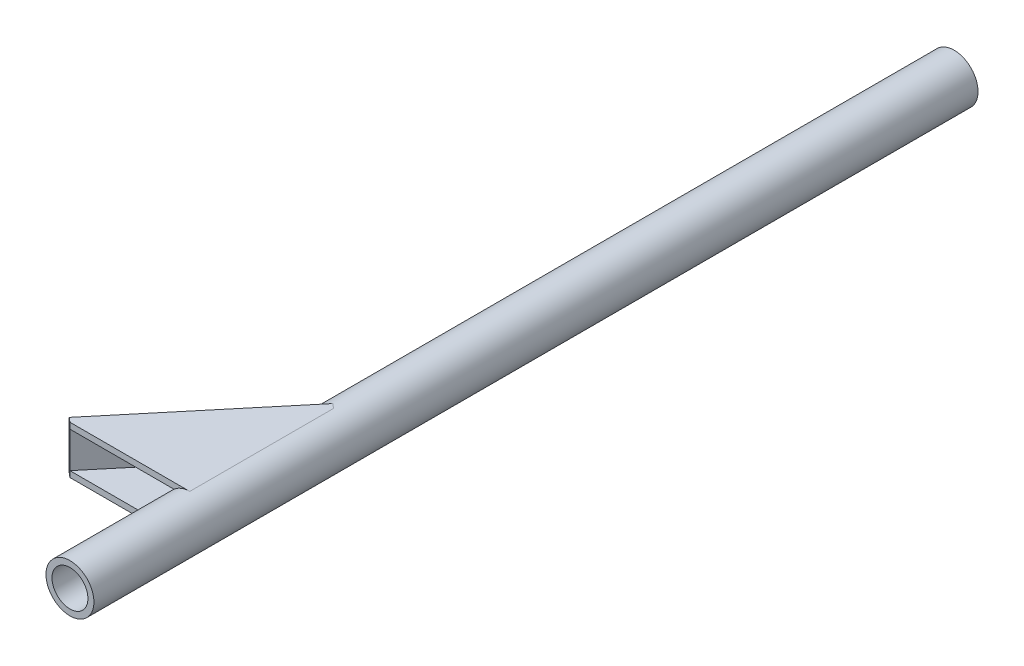
ISO-10303-21;
HEADER;
FILE_DESCRIPTION(('STEP AP214'),'2;1');
FILE_NAME('part.step','',(''),(''),'','','');
FILE_SCHEMA(('AUTOMOTIVE_DESIGN { 1 0 10303 214 1 1 1 1 }'));
ENDSEC;
DATA;
#1=APPLICATION_CONTEXT('core data for automotive mechanical design processes');
#2=APPLICATION_PROTOCOL_DEFINITION('international standard','automotive_design',2000,#1);
#3=PRODUCT_CONTEXT('',#1,'mechanical');
#4=PRODUCT('Part','Part','',(#3));
#5=PRODUCT_RELATED_PRODUCT_CATEGORY('part','',(#4));
#6=PRODUCT_DEFINITION_FORMATION('','',#4);
#7=PRODUCT_DEFINITION_CONTEXT('part definition',#1,'design');
#8=PRODUCT_DEFINITION('design','',#6,#7);
#9=PRODUCT_DEFINITION_SHAPE('','',#8);
#10=(LENGTH_UNIT() NAMED_UNIT(*) SI_UNIT(.MILLI.,.METRE.));
#11=(NAMED_UNIT(*) PLANE_ANGLE_UNIT() SI_UNIT($,.RADIAN.));
#12=(NAMED_UNIT(*) SI_UNIT($,.STERADIAN.) SOLID_ANGLE_UNIT());
#13=UNCERTAINTY_MEASURE_WITH_UNIT(LENGTH_MEASURE(1.E-05),#10,'distance_accuracy_value','');
#14=(GEOMETRIC_REPRESENTATION_CONTEXT(3) GLOBAL_UNCERTAINTY_ASSIGNED_CONTEXT((#13)) GLOBAL_UNIT_ASSIGNED_CONTEXT((#10,
#11,#12)) REPRESENTATION_CONTEXT('',''));
#15=CARTESIAN_POINT('',(0.,0.,0.));
#16=DIRECTION('',(0.,0.,1.));
#17=DIRECTION('',(1.,0.,0.));
#18=AXIS2_PLACEMENT_3D('',#15,#16,#17);
#19=CARTESIAN_POINT('',(0.,0.,0.));
#20=DIRECTION('',(0.,0.,-1.));
#21=DIRECTION('',(-1.,0.,0.));
#22=AXIS2_PLACEMENT_3D('',#19,#20,#21);
#23=CYLINDRICAL_SURFACE('',#22,20.);
#24=CARTESIAN_POINT('',(0.,0.,518.));
#25=DIRECTION('',(0.64018439966447,0.,-0.768221279597384));
#26=DIRECTION('',(-0.768221279597384,0.,-0.64018439966447));
#27=AXIS2_PLACEMENT_3D('',#24,#25,#26);
#28=ELLIPSE('',#27,26.0341655863552,20.);
#29=CARTESIAN_POINT('',(-3.8411063979869,-19.6276820241042,514.799078001678));
#30=VERTEX_POINT('',#29);
#31=CARTESIAN_POINT('',(0.,-20.,518.));
#32=VERTEX_POINT('',#31);
#33=EDGE_CURVE('E47',#30,#32,#28,.F.);
#34=ORIENTED_EDGE('',*,*,#33,.F.);
#35=CARTESIAN_POINT('',(0.,0.,510.189750324093));
#36=DIRECTION('',(-0.768221279597376,0.,-0.64018439966448));
#37=DIRECTION('',(0.64018439966448,0.,-0.768221279597376));
#38=AXIS2_PLACEMENT_3D('',#35,#36,#37);
#39=ELLIPSE('',#38,31.2409987036265,20.);
#40=CARTESIAN_POINT('',(-3.8411063979869,19.6276820241041,514.799078001678));
#41=VERTEX_POINT('',#40);
#42=EDGE_CURVE('E51',#41,#30,#39,.F.);
#43=ORIENTED_EDGE('',*,*,#42,.F.);
#44=CARTESIAN_POINT('',(0.,19.9999999999999,518.));
#45=VERTEX_POINT('',#44);
#46=EDGE_CURVE('E127',#45,#41,#28,.F.);
#47=ORIENTED_EDGE('',*,*,#46,.F.);
#48=DIRECTION('',(0.,0.,-1.));
#49=VECTOR('',#48,1.);
#50=CARTESIAN_POINT('',(0.,20.,518.));
#51=LINE('',#50,#49);
#52=CARTESIAN_POINT('',(0.,20.,638.));
#53=VERTEX_POINT('',#52);
#54=EDGE_CURVE('E114',#53,#45,#51,.T.);
#55=ORIENTED_EDGE('',*,*,#54,.F.);
#56=CARTESIAN_POINT('',(0.,0.,638.));
#57=DIRECTION('',(0.,0.,-1.));
#58=DIRECTION('',(-1.,0.,0.));
#59=AXIS2_PLACEMENT_3D('',#56,#57,#58);
#60=CIRCLE('',#59,20.);
#61=CARTESIAN_POINT('',(-13.2287565553229,15.,638.));
#62=VERTEX_POINT('',#61);
#63=EDGE_CURVE('E125',#53,#62,#60,.F.);
#64=ORIENTED_EDGE('',*,*,#63,.T.);
#65=CARTESIAN_POINT('',(0.,0.,638.));
#66=DIRECTION('',(0.,0.,1.));
#67=DIRECTION('',(1.,0.,0.));
#68=AXIS2_PLACEMENT_3D('',#65,#66,#67);
#69=CIRCLE('',#68,20.);
#70=CARTESIAN_POINT('',(-13.2287565553229,-15.,638.));
#71=VERTEX_POINT('',#70);
#72=EDGE_CURVE('E204',#71,#62,#69,.F.);
#73=ORIENTED_EDGE('',*,*,#72,.F.);
#74=CARTESIAN_POINT('',(0.,-20.,638.));
#75=VERTEX_POINT('',#74);
#76=EDGE_CURVE('E40',#75,#71,#69,.F.);
#77=ORIENTED_EDGE('',*,*,#76,.F.);
#78=DIRECTION('',(0.,0.,-1.));
#79=VECTOR('',#78,1.);
#80=CARTESIAN_POINT('',(0.,-20.,518.));
#81=LINE('',#80,#79);
#82=EDGE_CURVE('E124',#75,#32,#81,.T.);
#83=ORIENTED_EDGE('',*,*,#82,.T.);
#84=EDGE_LOOP('',(#34,#43,#47,#55,#64,#73,#77,#83));
#85=FACE_BOUND('',#84,.T.);
#86=CARTESIAN_POINT('',(0.,0.,738.));
#87=DIRECTION('',(0.,0.,-1.));
#88=DIRECTION('',(-1.,0.,0.));
#89=AXIS2_PLACEMENT_3D('',#86,#87,#88);
#90=CIRCLE('',#89,19.9999999999999);
#91=CARTESIAN_POINT('',(-19.9999999999999,0.,738.));
#92=VERTEX_POINT('',#91);
#93=EDGE_CURVE('E196',#92,#92,#90,.T.);
#94=ORIENTED_EDGE('',*,*,#93,.T.);
#95=EDGE_LOOP('',(#94));
#96=FACE_BOUND('',#95,.T.);
#97=CARTESIAN_POINT('',(0.,0.,0.));
#98=DIRECTION('',(0.,0.,-1.));
#99=DIRECTION('',(-1.,0.,0.));
#100=AXIS2_PLACEMENT_3D('',#97,#98,#99);
#101=CIRCLE('',#100,20.);
#102=CARTESIAN_POINT('',(-20.,0.,0.));
#103=VERTEX_POINT('',#102);
#104=EDGE_CURVE('E193',#103,#103,#101,.T.);
#105=ORIENTED_EDGE('',*,*,#104,.F.);
#106=EDGE_LOOP('',(#105));
#107=FACE_BOUND('',#106,.T.);
#108=ADVANCED_FACE('F32',(#85,#96,#107),#23,.T.);
#109=CARTESIAN_POINT('',(-19.9999999999999,-20.,638.));
#110=DIRECTION('',(0.,0.,1.));
#111=DIRECTION('',(1.,0.,0.));
#112=AXIS2_PLACEMENT_3D('',#109,#110,#111);
#113=PLANE('',#112);
#114=DIRECTION('',(1.,0.,0.));
#115=VECTOR('',#114,1.);
#116=CARTESIAN_POINT('',(-99.9999999999999,-15.,638.));
#117=LINE('',#116,#115);
#118=CARTESIAN_POINT('',(0.,-15.,638.));
#119=VERTEX_POINT('',#118);
#120=EDGE_CURVE('E170',#71,#119,#117,.T.);
#121=ORIENTED_EDGE('',*,*,#120,.F.);
#122=ORIENTED_EDGE('',*,*,#72,.T.);
#123=DIRECTION('',(1.,0.,0.));
#124=VECTOR('',#123,1.);
#125=CARTESIAN_POINT('',(-99.9999999999999,15.,638.));
#126=LINE('',#125,#124);
#127=CARTESIAN_POINT('',(0.,15.,638.));
#128=VERTEX_POINT('',#127);
#129=EDGE_CURVE('E177',#62,#128,#126,.T.);
#130=ORIENTED_EDGE('',*,*,#129,.T.);
#131=CARTESIAN_POINT('',(0.,0.,638.));
#132=DIRECTION('',(0.,0.,1.));
#133=DIRECTION('',(1.,0.,0.));
#134=AXIS2_PLACEMENT_3D('',#131,#132,#133);
#135=CIRCLE('',#134,15.);
#136=EDGE_CURVE('E190',#128,#119,#135,.T.);
#137=ORIENTED_EDGE('',*,*,#136,.T.);
#138=EDGE_LOOP('',(#121,#122,#130,#137));
#139=FACE_BOUND('',#138,.T.);
#140=ADVANCED_FACE('F212',(#139),#113,.F.);
#141=CARTESIAN_POINT('',(0.,20.,0.));
#142=DIRECTION('',(0.,0.,-1.));
#143=DIRECTION('',(-1.,0.,0.));
#144=AXIS2_PLACEMENT_3D('',#141,#142,#143);
#145=PLANE('',#144);
#146=ORIENTED_EDGE('',*,*,#104,.T.);
#147=EDGE_LOOP('',(#146));
#148=FACE_BOUND('',#147,.T.);
#149=CARTESIAN_POINT('',(0.,0.,0.));
#150=DIRECTION('',(0.,0.,-1.));
#151=DIRECTION('',(-1.,0.,0.));
#152=AXIS2_PLACEMENT_3D('',#149,#150,#151);
#153=CIRCLE('',#152,15.);
#154=CARTESIAN_POINT('',(-15.,0.,0.));
#155=VERTEX_POINT('',#154);
#156=EDGE_CURVE('E202',#155,#155,#153,.T.);
#157=ORIENTED_EDGE('',*,*,#156,.F.);
#158=EDGE_LOOP('',(#157));
#159=FACE_BOUND('',#158,.T.);
#160=ADVANCED_FACE('F34',(#148,#159),#145,.T.);
#161=CARTESIAN_POINT('',(0.,0.,0.));
#162=DIRECTION('',(0.,0.,-1.));
#163=DIRECTION('',(-1.,0.,0.));
#164=AXIS2_PLACEMENT_3D('',#161,#162,#163);
#165=CYLINDRICAL_SURFACE('',#164,15.);
#166=CARTESIAN_POINT('',(0.,0.,518.));
#167=DIRECTION('',(0.64018439966447,0.,-0.768221279597384));
#168=DIRECTION('',(-0.768221279597384,0.,-0.64018439966447));
#169=AXIS2_PLACEMENT_3D('',#166,#167,#168);
#170=ELLIPSE('',#169,19.5256241897664,15.);
#171=CARTESIAN_POINT('',(-3.8411063979869,14.49985867653,514.799078001678));
#172=VERTEX_POINT('',#171);
#173=CARTESIAN_POINT('',(0.,15.,518.));
#174=VERTEX_POINT('',#173);
#175=EDGE_CURVE('E131',#172,#174,#170,.T.);
#176=ORIENTED_EDGE('',*,*,#175,.F.);
#177=CARTESIAN_POINT('',(0.,0.,510.189750324093));
#178=DIRECTION('',(-0.768221279597376,0.,-0.64018439966448));
#179=DIRECTION('',(0.64018439966448,0.,-0.768221279597376));
#180=AXIS2_PLACEMENT_3D('',#177,#178,#179);
#181=ELLIPSE('',#180,23.4307490277199,15.);
#182=CARTESIAN_POINT('',(-3.8411063979869,-14.49985867653,514.799078001678));
#183=VERTEX_POINT('',#182);
#184=EDGE_CURVE('E11',#183,#172,#181,.T.);
#185=ORIENTED_EDGE('',*,*,#184,.F.);
#186=CARTESIAN_POINT('',(0.,-15.,518.));
#187=VERTEX_POINT('',#186);
#188=EDGE_CURVE('E155',#187,#183,#170,.T.);
#189=ORIENTED_EDGE('',*,*,#188,.F.);
#190=DIRECTION('',(0.,0.,-1.));
#191=VECTOR('',#190,1.);
#192=CARTESIAN_POINT('',(0.,-15.,0.));
#193=LINE('',#192,#191);
#194=EDGE_CURVE('E187',#119,#187,#193,.T.);
#195=ORIENTED_EDGE('',*,*,#194,.F.);
#196=ORIENTED_EDGE('',*,*,#136,.F.);
#197=DIRECTION('',(0.,0.,-1.));
#198=VECTOR('',#197,1.);
#199=CARTESIAN_POINT('',(0.,15.,0.));
#200=LINE('',#199,#198);
#201=EDGE_CURVE('E184',#174,#128,#200,.F.);
#202=ORIENTED_EDGE('',*,*,#201,.F.);
#203=EDGE_LOOP('',(#176,#185,#189,#195,#196,#202));
#204=FACE_BOUND('',#203,.T.);
#205=ORIENTED_EDGE('',*,*,#156,.T.);
#206=EDGE_LOOP('',(#205));
#207=FACE_BOUND('',#206,.T.);
#208=CARTESIAN_POINT('',(0.,0.,738.));
#209=DIRECTION('',(0.,0.,-1.));
#210=DIRECTION('',(-1.,0.,0.));
#211=AXIS2_PLACEMENT_3D('',#208,#209,#210);
#212=CIRCLE('',#211,14.9999999999999);
#213=CARTESIAN_POINT('',(-14.9999999999999,0.,738.));
#214=VERTEX_POINT('',#213);
#215=EDGE_CURVE('E199',#214,#214,#212,.T.);
#216=ORIENTED_EDGE('',*,*,#215,.F.);
#217=EDGE_LOOP('',(#216));
#218=FACE_BOUND('',#217,.T.);
#219=ADVANCED_FACE('F237',(#204,#207,#218),#165,.F.);
#220=CARTESIAN_POINT('',(0.,19.9999999999999,738.));
#221=DIRECTION('',(0.,0.,1.));
#222=DIRECTION('',(1.,0.,0.));
#223=AXIS2_PLACEMENT_3D('',#220,#221,#222);
#224=PLANE('',#223);
#225=ORIENTED_EDGE('',*,*,#215,.T.);
#226=EDGE_LOOP('',(#225));
#227=FACE_BOUND('',#226,.T.);
#228=ORIENTED_EDGE('',*,*,#93,.F.);
#229=EDGE_LOOP('',(#228));
#230=FACE_BOUND('',#229,.T.);
#231=ADVANCED_FACE('F265',(#227,#230),#224,.T.);
#232=CARTESIAN_POINT('',(-99.9999999999999,15.,638.));
#233=DIRECTION('',(0.,0.,-1.));
#234=DIRECTION('',(-1.,0.,0.));
#235=AXIS2_PLACEMENT_3D('',#232,#233,#234);
#236=PLANE('',#235);
#237=ORIENTED_EDGE('',*,*,#63,.F.);
#238=DIRECTION('',(1.,0.,0.));
#239=VECTOR('',#238,1.);
#240=CARTESIAN_POINT('',(-99.9999999999999,20.,638.));
#241=LINE('',#240,#239);
#242=CARTESIAN_POINT('',(-99.9999999999999,19.9999999999999,638.));
#243=VERTEX_POINT('',#242);
#244=EDGE_CURVE('E121',#243,#53,#241,.T.);
#245=ORIENTED_EDGE('',*,*,#244,.F.);
#246=DIRECTION('',(0.,1.,0.));
#247=VECTOR('',#246,1.);
#248=CARTESIAN_POINT('',(-99.9999999999999,15.,638.));
#249=LINE('',#248,#247);
#250=CARTESIAN_POINT('',(-99.9999999999999,15.,638.));
#251=VERTEX_POINT('',#250);
#252=EDGE_CURVE('E174',#251,#243,#249,.T.);
#253=ORIENTED_EDGE('',*,*,#252,.F.);
#254=EDGE_CURVE('E178',#251,#62,#126,.T.);
#255=ORIENTED_EDGE('',*,*,#254,.T.);
#256=EDGE_LOOP('',(#237,#245,#253,#255));
#257=FACE_BOUND('',#256,.T.);
#258=ADVANCED_FACE('F219',(#257),#236,.F.);
#259=CARTESIAN_POINT('',(-99.9999999999999,20.,638.));
#260=DIRECTION('',(0.,-1.,0.));
#261=DIRECTION('',(0.,0.,-1.));
#262=AXIS2_PLACEMENT_3D('',#259,#260,#261);
#263=PLANE('',#262);
#264=ORIENTED_EDGE('',*,*,#54,.T.);
#265=DIRECTION('',(-0.768221279597384,0.,-0.64018439966447));
#266=VECTOR('',#265,1.);
#267=CARTESIAN_POINT('',(0.,19.9999999999999,518.));
#268=LINE('',#267,#266);
#269=CARTESIAN_POINT('',(-3.8411063979869,19.9999999999999,514.799078001678));
#270=VERTEX_POINT('',#269);
#271=EDGE_CURVE('E118',#45,#270,#268,.T.);
#272=ORIENTED_EDGE('',*,*,#271,.T.);
#273=DIRECTION('',(-0.64018439966448,0.,0.768221279597376));
#274=VECTOR('',#273,1.);
#275=CARTESIAN_POINT('',(-103.841106397987,19.9999999999999,634.799078001678));
#276=LINE('',#275,#274);
#277=CARTESIAN_POINT('',(-103.841106397987,19.9999999999999,634.799078001678));
#278=VERTEX_POINT('',#277);
#279=EDGE_CURVE('E135',#270,#278,#276,.T.);
#280=ORIENTED_EDGE('',*,*,#279,.T.);
#281=DIRECTION('',(0.768221279597371,0.,0.640184399664486));
#282=VECTOR('',#281,1.);
#283=CARTESIAN_POINT('',(-99.9999999999999,19.9999999999999,638.));
#284=LINE('',#283,#282);
#285=EDGE_CURVE('E136',#278,#243,#284,.T.);
#286=ORIENTED_EDGE('',*,*,#285,.T.);
#287=ORIENTED_EDGE('',*,*,#244,.T.);
#288=EDGE_LOOP('',(#264,#272,#280,#286,#287));
#289=FACE_BOUND('',#288,.T.);
#290=ADVANCED_FACE('F115',(#289),#263,.F.);
#291=CARTESIAN_POINT('',(-99.9999999999999,15.,638.));
#292=DIRECTION('',(0.,1.,0.));
#293=DIRECTION('',(0.,0.,1.));
#294=AXIS2_PLACEMENT_3D('',#291,#292,#293);
#295=PLANE('',#294);
#296=DIRECTION('',(0.64018439966448,0.,-0.768221279597376));
#297=VECTOR('',#296,1.);
#298=CARTESIAN_POINT('',(-99.9999999999999,15.,638.));
#299=LINE('',#298,#297);
#300=EDGE_CURVE('E162',#251,#174,#299,.T.);
#301=ORIENTED_EDGE('',*,*,#300,.T.);
#302=ORIENTED_EDGE('',*,*,#201,.T.);
#303=ORIENTED_EDGE('',*,*,#129,.F.);
#304=ORIENTED_EDGE('',*,*,#254,.F.);
#305=EDGE_LOOP('',(#301,#302,#303,#304));
#306=FACE_BOUND('',#305,.T.);
#307=ADVANCED_FACE('F216',(#306),#295,.F.);
#308=CARTESIAN_POINT('',(-99.9999999999999,-15.,638.));
#309=DIRECTION('',(0.,0.,-1.));
#310=DIRECTION('',(-1.,0.,0.));
#311=AXIS2_PLACEMENT_3D('',#308,#309,#310);
#312=PLANE('',#311);
#313=ORIENTED_EDGE('',*,*,#76,.T.);
#314=CARTESIAN_POINT('',(-99.9999999999999,-15.,638.));
#315=VERTEX_POINT('',#314);
#316=EDGE_CURVE('E171',#315,#71,#117,.T.);
#317=ORIENTED_EDGE('',*,*,#316,.F.);
#318=DIRECTION('',(0.,1.,0.));
#319=VECTOR('',#318,1.);
#320=CARTESIAN_POINT('',(-99.9999999999999,-15.,638.));
#321=LINE('',#320,#319);
#322=CARTESIAN_POINT('',(-99.9999999999999,-20.,638.));
#323=VERTEX_POINT('',#322);
#324=EDGE_CURVE('E164',#323,#315,#321,.T.);
#325=ORIENTED_EDGE('',*,*,#324,.F.);
#326=DIRECTION('',(1.,0.,0.));
#327=VECTOR('',#326,1.);
#328=CARTESIAN_POINT('',(-99.9999999999999,-20.,638.));
#329=LINE('',#328,#327);
#330=EDGE_CURVE('E167',#323,#75,#329,.T.);
#331=ORIENTED_EDGE('',*,*,#330,.T.);
#332=EDGE_LOOP('',(#313,#317,#325,#331));
#333=FACE_BOUND('',#332,.T.);
#334=ADVANCED_FACE('F231',(#333),#312,.F.);
#335=CARTESIAN_POINT('',(-99.9999999999999,-15.,638.));
#336=DIRECTION('',(0.,-1.,0.));
#337=DIRECTION('',(0.,0.,-1.));
#338=AXIS2_PLACEMENT_3D('',#335,#336,#337);
#339=PLANE('',#338);
#340=ORIENTED_EDGE('',*,*,#194,.T.);
#341=DIRECTION('',(-0.64018439966448,0.,0.768221279597376));
#342=VECTOR('',#341,1.);
#343=CARTESIAN_POINT('',(-99.9999999999999,-15.,638.));
#344=LINE('',#343,#342);
#345=EDGE_CURVE('E160',#187,#315,#344,.T.);
#346=ORIENTED_EDGE('',*,*,#345,.T.);
#347=ORIENTED_EDGE('',*,*,#316,.T.);
#348=ORIENTED_EDGE('',*,*,#120,.T.);
#349=EDGE_LOOP('',(#340,#346,#347,#348));
#350=FACE_BOUND('',#349,.T.);
#351=ADVANCED_FACE('F233',(#350),#339,.F.);
#352=CARTESIAN_POINT('',(-99.9999999999999,-20.,638.));
#353=DIRECTION('',(0.,1.,0.));
#354=DIRECTION('',(0.,0.,1.));
#355=AXIS2_PLACEMENT_3D('',#352,#353,#354);
#356=PLANE('',#355);
#357=ORIENTED_EDGE('',*,*,#330,.F.);
#358=DIRECTION('',(-0.768221279597371,0.,-0.640184399664486));
#359=VECTOR('',#358,1.);
#360=CARTESIAN_POINT('',(-99.9999999999999,-20.,638.));
#361=LINE('',#360,#359);
#362=CARTESIAN_POINT('',(-103.841106397987,-20.,634.799078001678));
#363=VERTEX_POINT('',#362);
#364=EDGE_CURVE('E157',#323,#363,#361,.T.);
#365=ORIENTED_EDGE('',*,*,#364,.T.);
#366=DIRECTION('',(0.64018439966448,0.,-0.768221279597376));
#367=VECTOR('',#366,1.);
#368=CARTESIAN_POINT('',(-103.841106397987,-20.,634.799078001678));
#369=LINE('',#368,#367);
#370=CARTESIAN_POINT('',(-3.8411063979869,-20.,514.799078001678));
#371=VERTEX_POINT('',#370);
#372=EDGE_CURVE('E404',#363,#371,#369,.T.);
#373=ORIENTED_EDGE('',*,*,#372,.T.);
#374=DIRECTION('',(0.768221279597384,0.,0.64018439966447));
#375=VECTOR('',#374,1.);
#376=CARTESIAN_POINT('',(0.,-20.,518.));
#377=LINE('',#376,#375);
#378=EDGE_CURVE('E145',#371,#32,#377,.T.);
#379=ORIENTED_EDGE('',*,*,#378,.T.);
#380=ORIENTED_EDGE('',*,*,#82,.F.);
#381=EDGE_LOOP('',(#357,#365,#373,#379,#380));
#382=FACE_BOUND('',#381,.T.);
#383=ADVANCED_FACE('F254',(#382),#356,.F.);
#384=CARTESIAN_POINT('',(-103.841106397987,-181.125549057853,634.799078001678));
#385=DIRECTION('',(-0.768221279597376,0.,-0.64018439966448));
#386=DIRECTION('',(-0.64018439966448,0.,0.768221279597376));
#387=AXIS2_PLACEMENT_3D('',#384,#385,#386);
#388=PLANE('',#387);
#389=DIRECTION('',(0.,1.,0.));
#390=VECTOR('',#389,1.);
#391=CARTESIAN_POINT('',(-3.8411063979869,-181.125549057853,514.799078001678));
#392=LINE('',#391,#390);
#393=EDGE_CURVE('E134',#41,#270,#392,.T.);
#394=ORIENTED_EDGE('',*,*,#393,.F.);
#395=ORIENTED_EDGE('',*,*,#42,.T.);
#396=EDGE_CURVE('E146',#371,#30,#392,.T.);
#397=ORIENTED_EDGE('',*,*,#396,.F.);
#398=ORIENTED_EDGE('',*,*,#372,.F.);
#399=DIRECTION('',(0.,1.,0.));
#400=VECTOR('',#399,1.);
#401=CARTESIAN_POINT('',(-103.841106397987,-181.125549057853,634.799078001678));
#402=LINE('',#401,#400);
#403=EDGE_CURVE('E143',#363,#278,#402,.T.);
#404=ORIENTED_EDGE('',*,*,#403,.T.);
#405=ORIENTED_EDGE('',*,*,#279,.F.);
#406=EDGE_LOOP('',(#394,#395,#397,#398,#404,#405));
#407=FACE_BOUND('',#406,.T.);
#408=ADVANCED_FACE('F247',(#407),#388,.T.);
#409=EDGE_CURVE('E149',#183,#172,#392,.T.);
#410=ORIENTED_EDGE('',*,*,#409,.F.);
#411=ORIENTED_EDGE('',*,*,#184,.T.);
#412=EDGE_LOOP('',(#410,#411));
#413=FACE_BOUND('',#412,.T.);
#414=ADVANCED_FACE('F245',(#413),#388,.T.);
#415=CARTESIAN_POINT('',(-99.9999999999999,-181.125549057853,638.));
#416=DIRECTION('',(0.768221279597376,0.,0.64018439966448));
#417=DIRECTION('',(0.64018439966448,0.,-0.768221279597376));
#418=AXIS2_PLACEMENT_3D('',#415,#416,#417);
#419=PLANE('',#418);
#420=ORIENTED_EDGE('',*,*,#300,.F.);
#421=DIRECTION('',(0.,1.,0.));
#422=VECTOR('',#421,1.);
#423=CARTESIAN_POINT('',(-99.9999999999999,-181.125549057853,638.));
#424=LINE('',#423,#422);
#425=EDGE_CURVE('E138',#315,#251,#424,.T.);
#426=ORIENTED_EDGE('',*,*,#425,.F.);
#427=ORIENTED_EDGE('',*,*,#345,.F.);
#428=DIRECTION('',(0.,1.,0.));
#429=VECTOR('',#428,1.);
#430=CARTESIAN_POINT('',(0.,-181.125549057853,518.));
#431=LINE('',#430,#429);
#432=EDGE_CURVE('E150',#187,#174,#431,.T.);
#433=ORIENTED_EDGE('',*,*,#432,.T.);
#434=EDGE_LOOP('',(#420,#426,#427,#433));
#435=FACE_BOUND('',#434,.T.);
#436=ADVANCED_FACE('F225',(#435),#419,.T.);
#437=CARTESIAN_POINT('',(0.,-181.125549057853,518.));
#438=DIRECTION('',(0.64018439966447,0.,-0.768221279597384));
#439=DIRECTION('',(-0.768221279597384,0.,-0.64018439966447));
#440=AXIS2_PLACEMENT_3D('',#437,#438,#439);
#441=PLANE('',#440);
#442=ORIENTED_EDGE('',*,*,#271,.F.);
#443=ORIENTED_EDGE('',*,*,#46,.T.);
#444=ORIENTED_EDGE('',*,*,#393,.T.);
#445=EDGE_LOOP('',(#442,#443,#444));
#446=FACE_BOUND('',#445,.T.);
#447=ADVANCED_FACE('F133',(#446),#441,.T.);
#448=ORIENTED_EDGE('',*,*,#396,.T.);
#449=ORIENTED_EDGE('',*,*,#33,.T.);
#450=ORIENTED_EDGE('',*,*,#378,.F.);
#451=EDGE_LOOP('',(#448,#449,#450));
#452=FACE_BOUND('',#451,.T.);
#453=ADVANCED_FACE('F374',(#452),#441,.T.);
#454=CARTESIAN_POINT('',(-99.9999999999999,-181.125549057853,638.));
#455=DIRECTION('',(-0.640184399664486,0.,0.768221279597371));
#456=DIRECTION('',(0.768221279597371,0.,0.640184399664486));
#457=AXIS2_PLACEMENT_3D('',#454,#455,#456);
#458=PLANE('',#457);
#459=ORIENTED_EDGE('',*,*,#364,.F.);
#460=ORIENTED_EDGE('',*,*,#324,.T.);
#461=ORIENTED_EDGE('',*,*,#425,.T.);
#462=ORIENTED_EDGE('',*,*,#252,.T.);
#463=ORIENTED_EDGE('',*,*,#285,.F.);
#464=ORIENTED_EDGE('',*,*,#403,.F.);
#465=EDGE_LOOP('',(#459,#460,#461,#462,#463,#464));
#466=FACE_BOUND('',#465,.T.);
#467=ADVANCED_FACE('F228',(#466),#458,.T.);
#468=ORIENTED_EDGE('',*,*,#409,.T.);
#469=ORIENTED_EDGE('',*,*,#175,.T.);
#470=ORIENTED_EDGE('',*,*,#432,.F.);
#471=ORIENTED_EDGE('',*,*,#188,.T.);
#472=EDGE_LOOP('',(#468,#469,#470,#471));
#473=FACE_BOUND('',#472,.T.);
#474=ADVANCED_FACE('F242',(#473),#441,.T.);
#475=CLOSED_SHELL('',(#108,#140,#160,#219,#231,#258,#290,#307,#334,#351,#383,#408,#414,#436,
#447,#453,#467,#474));
#476=MANIFOLD_SOLID_BREP('B2',#475);
#477=ADVANCED_BREP_SHAPE_REPRESENTATION('',(#18,#476),#14);
#478=SHAPE_DEFINITION_REPRESENTATION(#9,#477);
ENDSEC;
END-ISO-10303-21;
